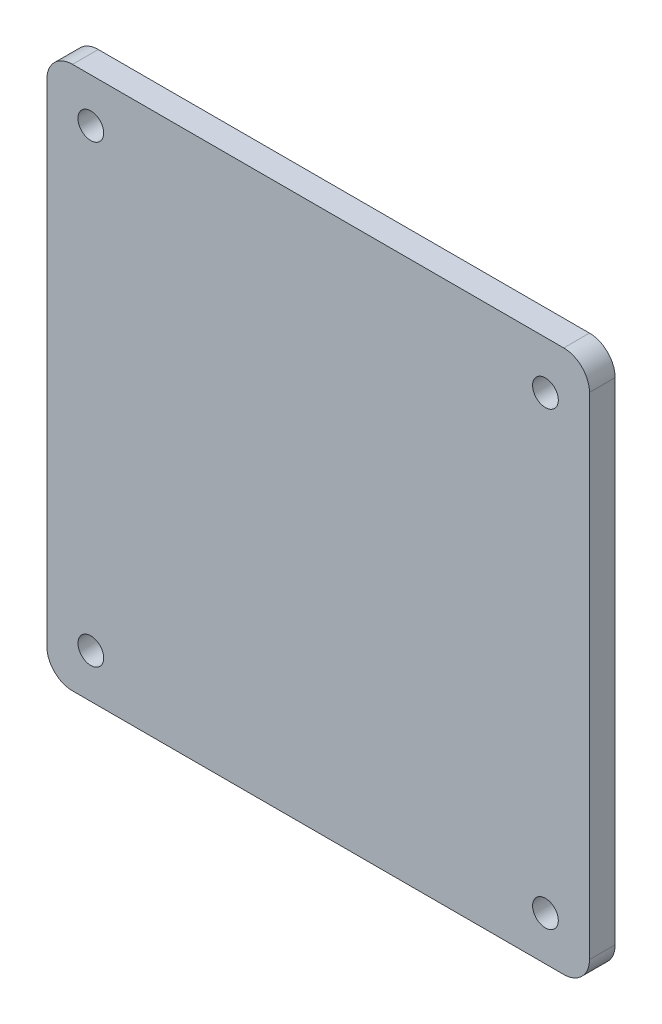
ISO-10303-21;
HEADER;
FILE_DESCRIPTION(('STEP AP214'),'2;1');
FILE_NAME('part.step','',(''),(''),'','','');
FILE_SCHEMA(('AUTOMOTIVE_DESIGN { 1 0 10303 214 1 1 1 1 }'));
ENDSEC;
DATA;
#1=APPLICATION_CONTEXT('core data for automotive mechanical design processes');
#2=APPLICATION_PROTOCOL_DEFINITION('international standard','automotive_design',2000,#1);
#3=PRODUCT_CONTEXT('',#1,'mechanical');
#4=PRODUCT('Part','Part','',(#3));
#5=PRODUCT_RELATED_PRODUCT_CATEGORY('part','',(#4));
#6=PRODUCT_DEFINITION_FORMATION('','',#4);
#7=PRODUCT_DEFINITION_CONTEXT('part definition',#1,'design');
#8=PRODUCT_DEFINITION('design','',#6,#7);
#9=PRODUCT_DEFINITION_SHAPE('','',#8);
#10=(LENGTH_UNIT() NAMED_UNIT(*) SI_UNIT(.MILLI.,.METRE.));
#11=(NAMED_UNIT(*) PLANE_ANGLE_UNIT() SI_UNIT($,.RADIAN.));
#12=(NAMED_UNIT(*) SI_UNIT($,.STERADIAN.) SOLID_ANGLE_UNIT());
#13=UNCERTAINTY_MEASURE_WITH_UNIT(LENGTH_MEASURE(1.E-05),#10,'distance_accuracy_value','');
#14=(GEOMETRIC_REPRESENTATION_CONTEXT(3) GLOBAL_UNCERTAINTY_ASSIGNED_CONTEXT((#13)) GLOBAL_UNIT_ASSIGNED_CONTEXT((#10,
#11,#12)) REPRESENTATION_CONTEXT('',''));
#15=CARTESIAN_POINT('',(0.,0.,0.));
#16=DIRECTION('',(0.,0.,1.));
#17=DIRECTION('',(1.,0.,0.));
#18=AXIS2_PLACEMENT_3D('',#15,#16,#17);
#19=CARTESIAN_POINT('',(-24.257,-24.257,2.54));
#20=DIRECTION('',(0.,0.,-1.));
#21=DIRECTION('',(-1.,0.,0.));
#22=AXIS2_PLACEMENT_3D('',#19,#20,#21);
#23=CYLINDRICAL_SURFACE('',#22,2.54);
#24=CARTESIAN_POINT('',(-24.257,-24.257,0.));
#25=DIRECTION('',(0.,0.,1.));
#26=DIRECTION('',(1.,0.,0.));
#27=AXIS2_PLACEMENT_3D('',#24,#25,#26);
#28=CIRCLE('',#27,2.54);
#29=CARTESIAN_POINT('',(-26.797,-24.257,0.));
#30=VERTEX_POINT('',#29);
#31=CARTESIAN_POINT('',(-24.257,-26.797,0.));
#32=VERTEX_POINT('',#31);
#33=EDGE_CURVE('E129',#30,#32,#28,.T.);
#34=ORIENTED_EDGE('',*,*,#33,.T.);
#35=DIRECTION('',(0.,0.,-1.));
#36=VECTOR('',#35,1.);
#37=CARTESIAN_POINT('',(-24.257,-26.797,2.54));
#38=LINE('',#37,#36);
#39=CARTESIAN_POINT('',(-24.257,-26.797,2.54));
#40=VERTEX_POINT('',#39);
#41=EDGE_CURVE('E11',#40,#32,#38,.T.);
#42=ORIENTED_EDGE('',*,*,#41,.F.);
#43=CARTESIAN_POINT('',(-24.257,-24.257,2.54));
#44=DIRECTION('',(0.,0.,1.));
#45=DIRECTION('',(1.,0.,0.));
#46=AXIS2_PLACEMENT_3D('',#43,#44,#45);
#47=CIRCLE('',#46,2.54);
#48=CARTESIAN_POINT('',(-26.797,-24.257,2.54));
#49=VERTEX_POINT('',#48);
#50=EDGE_CURVE('E144',#49,#40,#47,.T.);
#51=ORIENTED_EDGE('',*,*,#50,.F.);
#52=DIRECTION('',(0.,0.,-1.));
#53=VECTOR('',#52,1.);
#54=CARTESIAN_POINT('',(-26.797,-24.257,2.54));
#55=LINE('',#54,#53);
#56=EDGE_CURVE('E125',#49,#30,#55,.T.);
#57=ORIENTED_EDGE('',*,*,#56,.T.);
#58=EDGE_LOOP('',(#34,#42,#51,#57));
#59=FACE_BOUND('',#58,.T.);
#60=ADVANCED_FACE('F33',(#59),#23,.T.);
#61=CARTESIAN_POINT('',(24.257,-26.797,2.54));
#62=DIRECTION('',(0.,1.,0.));
#63=DIRECTION('',(-1.,0.,0.));
#64=AXIS2_PLACEMENT_3D('',#61,#62,#63);
#65=PLANE('',#64);
#66=DIRECTION('',(1.,0.,0.));
#67=VECTOR('',#66,1.);
#68=CARTESIAN_POINT('',(24.257,-26.797,0.));
#69=LINE('',#68,#67);
#70=CARTESIAN_POINT('',(24.257,-26.797,0.));
#71=VERTEX_POINT('',#70);
#72=EDGE_CURVE('E132',#32,#71,#69,.T.);
#73=ORIENTED_EDGE('',*,*,#72,.T.);
#74=DIRECTION('',(0.,0.,-1.));
#75=VECTOR('',#74,1.);
#76=CARTESIAN_POINT('',(24.257,-26.797,2.54));
#77=LINE('',#76,#75);
#78=CARTESIAN_POINT('',(24.257,-26.797,2.54));
#79=VERTEX_POINT('',#78);
#80=EDGE_CURVE('E41',#79,#71,#77,.T.);
#81=ORIENTED_EDGE('',*,*,#80,.F.);
#82=DIRECTION('',(1.,0.,0.));
#83=VECTOR('',#82,1.);
#84=CARTESIAN_POINT('',(24.257,-26.797,2.54));
#85=LINE('',#84,#83);
#86=EDGE_CURVE('E92',#40,#79,#85,.T.);
#87=ORIENTED_EDGE('',*,*,#86,.F.);
#88=ORIENTED_EDGE('',*,*,#41,.T.);
#89=EDGE_LOOP('',(#73,#81,#87,#88));
#90=FACE_BOUND('',#89,.T.);
#91=ADVANCED_FACE('F232',(#90),#65,.F.);
#92=CARTESIAN_POINT('',(24.257,-24.257,2.54));
#93=DIRECTION('',(0.,0.,-1.));
#94=DIRECTION('',(-1.,0.,0.));
#95=AXIS2_PLACEMENT_3D('',#92,#93,#94);
#96=CYLINDRICAL_SURFACE('',#95,2.54);
#97=CARTESIAN_POINT('',(24.257,-24.257,0.));
#98=DIRECTION('',(0.,0.,1.));
#99=DIRECTION('',(-1.,0.,0.));
#100=AXIS2_PLACEMENT_3D('',#97,#98,#99);
#101=CIRCLE('',#100,2.54);
#102=CARTESIAN_POINT('',(26.797,-24.257,0.));
#103=VERTEX_POINT('',#102);
#104=EDGE_CURVE('E135',#71,#103,#101,.T.);
#105=ORIENTED_EDGE('',*,*,#104,.T.);
#106=DIRECTION('',(0.,0.,-1.));
#107=VECTOR('',#106,1.);
#108=CARTESIAN_POINT('',(26.797,-24.257,2.54));
#109=LINE('',#108,#107);
#110=CARTESIAN_POINT('',(26.797,-24.257,2.54));
#111=VERTEX_POINT('',#110);
#112=EDGE_CURVE('E151',#111,#103,#109,.T.);
#113=ORIENTED_EDGE('',*,*,#112,.F.);
#114=CARTESIAN_POINT('',(24.257,-24.257,2.54));
#115=DIRECTION('',(0.,0.,1.));
#116=DIRECTION('',(-1.,0.,0.));
#117=AXIS2_PLACEMENT_3D('',#114,#115,#116);
#118=CIRCLE('',#117,2.54);
#119=EDGE_CURVE('E159',#79,#111,#118,.T.);
#120=ORIENTED_EDGE('',*,*,#119,.F.);
#121=ORIENTED_EDGE('',*,*,#80,.T.);
#122=EDGE_LOOP('',(#105,#113,#120,#121));
#123=FACE_BOUND('',#122,.T.);
#124=ADVANCED_FACE('F157',(#123),#96,.T.);
#125=CARTESIAN_POINT('',(26.797,24.257,2.54));
#126=DIRECTION('',(-1.,0.,0.));
#127=DIRECTION('',(0.,0.,1.));
#128=AXIS2_PLACEMENT_3D('',#125,#126,#127);
#129=PLANE('',#128);
#130=DIRECTION('',(0.,1.,0.));
#131=VECTOR('',#130,1.);
#132=CARTESIAN_POINT('',(26.797,24.257,0.));
#133=LINE('',#132,#131);
#134=CARTESIAN_POINT('',(26.797,24.257,0.));
#135=VERTEX_POINT('',#134);
#136=EDGE_CURVE('E137',#103,#135,#133,.T.);
#137=ORIENTED_EDGE('',*,*,#136,.T.);
#138=DIRECTION('',(0.,0.,-1.));
#139=VECTOR('',#138,1.);
#140=CARTESIAN_POINT('',(26.797,24.257,2.54));
#141=LINE('',#140,#139);
#142=CARTESIAN_POINT('',(26.797,24.257,2.54));
#143=VERTEX_POINT('',#142);
#144=EDGE_CURVE('E148',#143,#135,#141,.T.);
#145=ORIENTED_EDGE('',*,*,#144,.F.);
#146=DIRECTION('',(0.,1.,0.));
#147=VECTOR('',#146,1.);
#148=CARTESIAN_POINT('',(26.797,24.257,2.54));
#149=LINE('',#148,#147);
#150=EDGE_CURVE('E171',#111,#143,#149,.T.);
#151=ORIENTED_EDGE('',*,*,#150,.F.);
#152=ORIENTED_EDGE('',*,*,#112,.T.);
#153=EDGE_LOOP('',(#137,#145,#151,#152));
#154=FACE_BOUND('',#153,.T.);
#155=ADVANCED_FACE('F167',(#154),#129,.F.);
#156=CARTESIAN_POINT('',(24.257,24.257,2.54));
#157=DIRECTION('',(0.,0.,-1.));
#158=DIRECTION('',(-1.,0.,0.));
#159=AXIS2_PLACEMENT_3D('',#156,#157,#158);
#160=CYLINDRICAL_SURFACE('',#159,2.54);
#161=CARTESIAN_POINT('',(24.257,24.257,0.));
#162=DIRECTION('',(0.,0.,1.));
#163=DIRECTION('',(-1.,0.,0.));
#164=AXIS2_PLACEMENT_3D('',#161,#162,#163);
#165=CIRCLE('',#164,2.54);
#166=CARTESIAN_POINT('',(24.257,26.797,0.));
#167=VERTEX_POINT('',#166);
#168=EDGE_CURVE('E139',#135,#167,#165,.T.);
#169=ORIENTED_EDGE('',*,*,#168,.T.);
#170=DIRECTION('',(0.,0.,-1.));
#171=VECTOR('',#170,1.);
#172=CARTESIAN_POINT('',(24.257,26.797,2.54));
#173=LINE('',#172,#171);
#174=CARTESIAN_POINT('',(24.257,26.797,2.54));
#175=VERTEX_POINT('',#174);
#176=EDGE_CURVE('E120',#175,#167,#173,.T.);
#177=ORIENTED_EDGE('',*,*,#176,.F.);
#178=CARTESIAN_POINT('',(24.257,24.257,2.54));
#179=DIRECTION('',(0.,0.,1.));
#180=DIRECTION('',(-1.,0.,0.));
#181=AXIS2_PLACEMENT_3D('',#178,#179,#180);
#182=CIRCLE('',#181,2.54);
#183=EDGE_CURVE('E111',#143,#175,#182,.T.);
#184=ORIENTED_EDGE('',*,*,#183,.F.);
#185=ORIENTED_EDGE('',*,*,#144,.T.);
#186=EDGE_LOOP('',(#169,#177,#184,#185));
#187=FACE_BOUND('',#186,.T.);
#188=ADVANCED_FACE('F170',(#187),#160,.T.);
#189=CARTESIAN_POINT('',(24.257,26.797,2.54));
#190=DIRECTION('',(0.,-1.,0.));
#191=DIRECTION('',(1.,0.,0.));
#192=AXIS2_PLACEMENT_3D('',#189,#190,#191);
#193=PLANE('',#192);
#194=DIRECTION('',(-1.,0.,0.));
#195=VECTOR('',#194,1.);
#196=CARTESIAN_POINT('',(24.257,26.797,0.));
#197=LINE('',#196,#195);
#198=CARTESIAN_POINT('',(-24.257,26.797,0.));
#199=VERTEX_POINT('',#198);
#200=EDGE_CURVE('E119',#167,#199,#197,.T.);
#201=ORIENTED_EDGE('',*,*,#200,.T.);
#202=DIRECTION('',(0.,0.,-1.));
#203=VECTOR('',#202,1.);
#204=CARTESIAN_POINT('',(-24.257,26.797,2.54));
#205=LINE('',#204,#203);
#206=CARTESIAN_POINT('',(-24.257,26.797,2.54));
#207=VERTEX_POINT('',#206);
#208=EDGE_CURVE('E116',#207,#199,#205,.T.);
#209=ORIENTED_EDGE('',*,*,#208,.F.);
#210=DIRECTION('',(-1.,0.,0.));
#211=VECTOR('',#210,1.);
#212=CARTESIAN_POINT('',(24.257,26.797,2.54));
#213=LINE('',#212,#211);
#214=EDGE_CURVE('E105',#175,#207,#213,.T.);
#215=ORIENTED_EDGE('',*,*,#214,.F.);
#216=ORIENTED_EDGE('',*,*,#176,.T.);
#217=EDGE_LOOP('',(#201,#209,#215,#216));
#218=FACE_BOUND('',#217,.T.);
#219=ADVANCED_FACE('F117',(#218),#193,.F.);
#220=CARTESIAN_POINT('',(-24.257,24.257,2.54));
#221=DIRECTION('',(0.,0.,-1.));
#222=DIRECTION('',(-1.,0.,0.));
#223=AXIS2_PLACEMENT_3D('',#220,#221,#222);
#224=CYLINDRICAL_SURFACE('',#223,2.54);
#225=CARTESIAN_POINT('',(-24.257,24.257,0.));
#226=DIRECTION('',(0.,0.,1.));
#227=DIRECTION('',(-1.,0.,0.));
#228=AXIS2_PLACEMENT_3D('',#225,#226,#227);
#229=CIRCLE('',#228,2.54);
#230=CARTESIAN_POINT('',(-26.797,24.257,0.));
#231=VERTEX_POINT('',#230);
#232=EDGE_CURVE('E78',#199,#231,#229,.T.);
#233=ORIENTED_EDGE('',*,*,#232,.T.);
#234=DIRECTION('',(0.,0.,-1.));
#235=VECTOR('',#234,1.);
#236=CARTESIAN_POINT('',(-26.797,24.257,2.54));
#237=LINE('',#236,#235);
#238=CARTESIAN_POINT('',(-26.797,24.257,2.54));
#239=VERTEX_POINT('',#238);
#240=EDGE_CURVE('E121',#239,#231,#237,.T.);
#241=ORIENTED_EDGE('',*,*,#240,.F.);
#242=CARTESIAN_POINT('',(-24.257,24.257,2.54));
#243=DIRECTION('',(0.,0.,1.));
#244=DIRECTION('',(-1.,0.,0.));
#245=AXIS2_PLACEMENT_3D('',#242,#243,#244);
#246=CIRCLE('',#245,2.54);
#247=EDGE_CURVE('E109',#207,#239,#246,.T.);
#248=ORIENTED_EDGE('',*,*,#247,.F.);
#249=ORIENTED_EDGE('',*,*,#208,.T.);
#250=EDGE_LOOP('',(#233,#241,#248,#249));
#251=FACE_BOUND('',#250,.T.);
#252=ADVANCED_FACE('F123',(#251),#224,.T.);
#253=CARTESIAN_POINT('',(-26.797,24.257,2.54));
#254=DIRECTION('',(1.,0.,0.));
#255=DIRECTION('',(0.,1.,0.));
#256=AXIS2_PLACEMENT_3D('',#253,#254,#255);
#257=PLANE('',#256);
#258=DIRECTION('',(0.,-1.,0.));
#259=VECTOR('',#258,1.);
#260=CARTESIAN_POINT('',(-26.797,24.257,0.));
#261=LINE('',#260,#259);
#262=EDGE_CURVE('E84',#231,#30,#261,.T.);
#263=ORIENTED_EDGE('',*,*,#262,.T.);
#264=ORIENTED_EDGE('',*,*,#56,.F.);
#265=DIRECTION('',(0.,-1.,0.));
#266=VECTOR('',#265,1.);
#267=CARTESIAN_POINT('',(-26.797,24.257,2.54));
#268=LINE('',#267,#266);
#269=EDGE_CURVE('E49',#239,#49,#268,.T.);
#270=ORIENTED_EDGE('',*,*,#269,.F.);
#271=ORIENTED_EDGE('',*,*,#240,.T.);
#272=EDGE_LOOP('',(#263,#264,#270,#271));
#273=FACE_BOUND('',#272,.T.);
#274=ADVANCED_FACE('F239',(#273),#257,.F.);
#275=CARTESIAN_POINT('',(-24.257,-24.257,2.54));
#276=DIRECTION('',(0.,0.,1.));
#277=DIRECTION('',(1.,0.,0.));
#278=AXIS2_PLACEMENT_3D('',#275,#276,#277);
#279=PLANE('',#278);
#280=CARTESIAN_POINT('',(-22.4506403026729,22.4506403026729,2.54));
#281=DIRECTION('',(0.,0.,-1.));
#282=DIRECTION('',(-1.,0.,0.));
#283=AXIS2_PLACEMENT_3D('',#280,#281,#282);
#284=CIRCLE('',#283,1.27);
#285=CARTESIAN_POINT('',(-23.7206403026729,22.4506403026729,2.54));
#286=VERTEX_POINT('',#285);
#287=EDGE_CURVE('E192',#286,#286,#284,.T.);
#288=ORIENTED_EDGE('',*,*,#287,.T.);
#289=EDGE_LOOP('',(#288));
#290=FACE_BOUND('',#289,.T.);
#291=CARTESIAN_POINT('',(22.4506403026813,22.0606792129199,2.54));
#292=DIRECTION('',(0.,0.,-1.));
#293=DIRECTION('',(-1.,0.,0.));
#294=AXIS2_PLACEMENT_3D('',#291,#292,#293);
#295=CIRCLE('',#294,1.27);
#296=CARTESIAN_POINT('',(21.1806403026813,22.0606792129199,2.54));
#297=VERTEX_POINT('',#296);
#298=EDGE_CURVE('E186',#297,#297,#295,.T.);
#299=ORIENTED_EDGE('',*,*,#298,.T.);
#300=EDGE_LOOP('',(#299));
#301=FACE_BOUND('',#300,.T.);
#302=CARTESIAN_POINT('',(22.4506403026729,-22.4506403026729,2.54));
#303=DIRECTION('',(0.,0.,-1.));
#304=DIRECTION('',(-1.,0.,0.));
#305=AXIS2_PLACEMENT_3D('',#302,#303,#304);
#306=CIRCLE('',#305,1.27);
#307=CARTESIAN_POINT('',(21.1806403026729,-22.4506403026729,2.54));
#308=VERTEX_POINT('',#307);
#309=EDGE_CURVE('E180',#308,#308,#306,.T.);
#310=ORIENTED_EDGE('',*,*,#309,.T.);
#311=EDGE_LOOP('',(#310));
#312=FACE_BOUND('',#311,.T.);
#313=CARTESIAN_POINT('',(-22.4506403026729,-22.4506403026729,2.54));
#314=DIRECTION('',(0.,0.,-1.));
#315=DIRECTION('',(-1.,0.,0.));
#316=AXIS2_PLACEMENT_3D('',#313,#314,#315);
#317=CIRCLE('',#316,1.27);
#318=CARTESIAN_POINT('',(-23.7206403026729,-22.4506403026729,2.54));
#319=VERTEX_POINT('',#318);
#320=EDGE_CURVE('E133',#319,#319,#317,.T.);
#321=ORIENTED_EDGE('',*,*,#320,.T.);
#322=EDGE_LOOP('',(#321));
#323=FACE_BOUND('',#322,.T.);
#324=ORIENTED_EDGE('',*,*,#50,.T.);
#325=ORIENTED_EDGE('',*,*,#86,.T.);
#326=ORIENTED_EDGE('',*,*,#119,.T.);
#327=ORIENTED_EDGE('',*,*,#150,.T.);
#328=ORIENTED_EDGE('',*,*,#183,.T.);
#329=ORIENTED_EDGE('',*,*,#214,.T.);
#330=ORIENTED_EDGE('',*,*,#247,.T.);
#331=ORIENTED_EDGE('',*,*,#269,.T.);
#332=EDGE_LOOP('',(#324,#325,#326,#327,#328,#329,#330,#331));
#333=FACE_BOUND('',#332,.T.);
#334=ADVANCED_FACE('F107',(#290,#301,#312,#323,#333),#279,.T.);
#335=CARTESIAN_POINT('',(-24.257,-24.257,0.));
#336=DIRECTION('',(0.,0.,1.));
#337=DIRECTION('',(1.,0.,0.));
#338=AXIS2_PLACEMENT_3D('',#335,#336,#337);
#339=PLANE('',#338);
#340=CARTESIAN_POINT('',(-22.4506403026729,22.4506403026729,0.));
#341=DIRECTION('',(0.,0.,-1.));
#342=DIRECTION('',(-1.,0.,0.));
#343=AXIS2_PLACEMENT_3D('',#340,#341,#342);
#344=CIRCLE('',#343,1.27);
#345=CARTESIAN_POINT('',(-23.7206403026729,22.4506403026729,0.));
#346=VERTEX_POINT('',#345);
#347=EDGE_CURVE('E195',#346,#346,#344,.T.);
#348=ORIENTED_EDGE('',*,*,#347,.F.);
#349=EDGE_LOOP('',(#348));
#350=FACE_BOUND('',#349,.T.);
#351=CARTESIAN_POINT('',(22.4506403026813,22.0606792129199,0.));
#352=DIRECTION('',(0.,0.,-1.));
#353=DIRECTION('',(-1.,0.,0.));
#354=AXIS2_PLACEMENT_3D('',#351,#352,#353);
#355=CIRCLE('',#354,1.27);
#356=CARTESIAN_POINT('',(21.1806403026813,22.0606792129199,0.));
#357=VERTEX_POINT('',#356);
#358=EDGE_CURVE('E189',#357,#357,#355,.T.);
#359=ORIENTED_EDGE('',*,*,#358,.F.);
#360=EDGE_LOOP('',(#359));
#361=FACE_BOUND('',#360,.T.);
#362=CARTESIAN_POINT('',(22.4506403026729,-22.4506403026729,0.));
#363=DIRECTION('',(0.,0.,-1.));
#364=DIRECTION('',(-1.,0.,0.));
#365=AXIS2_PLACEMENT_3D('',#362,#363,#364);
#366=CIRCLE('',#365,1.27);
#367=CARTESIAN_POINT('',(21.1806403026729,-22.4506403026729,0.));
#368=VERTEX_POINT('',#367);
#369=EDGE_CURVE('E183',#368,#368,#366,.T.);
#370=ORIENTED_EDGE('',*,*,#369,.F.);
#371=EDGE_LOOP('',(#370));
#372=FACE_BOUND('',#371,.T.);
#373=CARTESIAN_POINT('',(-22.4506403026729,-22.4506403026729,0.));
#374=DIRECTION('',(0.,0.,-1.));
#375=DIRECTION('',(-1.,0.,0.));
#376=AXIS2_PLACEMENT_3D('',#373,#374,#375);
#377=CIRCLE('',#376,1.27);
#378=CARTESIAN_POINT('',(-23.7206403026729,-22.4506403026729,0.));
#379=VERTEX_POINT('',#378);
#380=EDGE_CURVE('E177',#379,#379,#377,.T.);
#381=ORIENTED_EDGE('',*,*,#380,.F.);
#382=EDGE_LOOP('',(#381));
#383=FACE_BOUND('',#382,.T.);
#384=ORIENTED_EDGE('',*,*,#33,.F.);
#385=ORIENTED_EDGE('',*,*,#262,.F.);
#386=ORIENTED_EDGE('',*,*,#232,.F.);
#387=ORIENTED_EDGE('',*,*,#200,.F.);
#388=ORIENTED_EDGE('',*,*,#168,.F.);
#389=ORIENTED_EDGE('',*,*,#136,.F.);
#390=ORIENTED_EDGE('',*,*,#104,.F.);
#391=ORIENTED_EDGE('',*,*,#72,.F.);
#392=EDGE_LOOP('',(#384,#385,#386,#387,#388,#389,#390,#391));
#393=FACE_BOUND('',#392,.T.);
#394=ADVANCED_FACE('F163',(#350,#361,#372,#383,#393),#339,.F.);
#395=CARTESIAN_POINT('',(-22.4506403026729,-22.4506403026729,2.54));
#396=DIRECTION('',(0.,0.,-1.));
#397=DIRECTION('',(-1.,0.,0.));
#398=AXIS2_PLACEMENT_3D('',#395,#396,#397);
#399=CYLINDRICAL_SURFACE('',#398,1.27);
#400=ORIENTED_EDGE('',*,*,#320,.F.);
#401=EDGE_LOOP('',(#400));
#402=FACE_BOUND('',#401,.T.);
#403=ORIENTED_EDGE('',*,*,#380,.T.);
#404=EDGE_LOOP('',(#403));
#405=FACE_BOUND('',#404,.T.);
#406=ADVANCED_FACE('F212',(#402,#405),#399,.F.);
#407=CARTESIAN_POINT('',(22.4506403026729,-22.4506403026729,2.54));
#408=DIRECTION('',(0.,0.,-1.));
#409=DIRECTION('',(-1.,0.,0.));
#410=AXIS2_PLACEMENT_3D('',#407,#408,#409);
#411=CYLINDRICAL_SURFACE('',#410,1.27);
#412=ORIENTED_EDGE('',*,*,#309,.F.);
#413=EDGE_LOOP('',(#412));
#414=FACE_BOUND('',#413,.T.);
#415=ORIENTED_EDGE('',*,*,#369,.T.);
#416=EDGE_LOOP('',(#415));
#417=FACE_BOUND('',#416,.T.);
#418=ADVANCED_FACE('F221',(#414,#417),#411,.F.);
#419=CARTESIAN_POINT('',(22.4506403026813,22.0606792129199,2.54));
#420=DIRECTION('',(0.,0.,-1.));
#421=DIRECTION('',(-1.,0.,0.));
#422=AXIS2_PLACEMENT_3D('',#419,#420,#421);
#423=CYLINDRICAL_SURFACE('',#422,1.27);
#424=ORIENTED_EDGE('',*,*,#298,.F.);
#425=EDGE_LOOP('',(#424));
#426=FACE_BOUND('',#425,.T.);
#427=ORIENTED_EDGE('',*,*,#358,.T.);
#428=EDGE_LOOP('',(#427));
#429=FACE_BOUND('',#428,.T.);
#430=ADVANCED_FACE('F206',(#426,#429),#423,.F.);
#431=CARTESIAN_POINT('',(-22.4506403026729,22.4506403026729,2.54));
#432=DIRECTION('',(0.,0.,-1.));
#433=DIRECTION('',(-1.,0.,0.));
#434=AXIS2_PLACEMENT_3D('',#431,#432,#433);
#435=CYLINDRICAL_SURFACE('',#434,1.27);
#436=ORIENTED_EDGE('',*,*,#287,.F.);
#437=EDGE_LOOP('',(#436));
#438=FACE_BOUND('',#437,.T.);
#439=ORIENTED_EDGE('',*,*,#347,.T.);
#440=EDGE_LOOP('',(#439));
#441=FACE_BOUND('',#440,.T.);
#442=ADVANCED_FACE('F203',(#438,#441),#435,.F.);
#443=CLOSED_SHELL('',(#60,#91,#124,#155,#188,#219,#252,#274,#334,#394,#406,#418,#430,#442));
#444=MANIFOLD_SOLID_BREP('B2',#443);
#445=ADVANCED_BREP_SHAPE_REPRESENTATION('',(#18,#444),#14);
#446=SHAPE_DEFINITION_REPRESENTATION(#9,#445);
ENDSEC;
END-ISO-10303-21;
